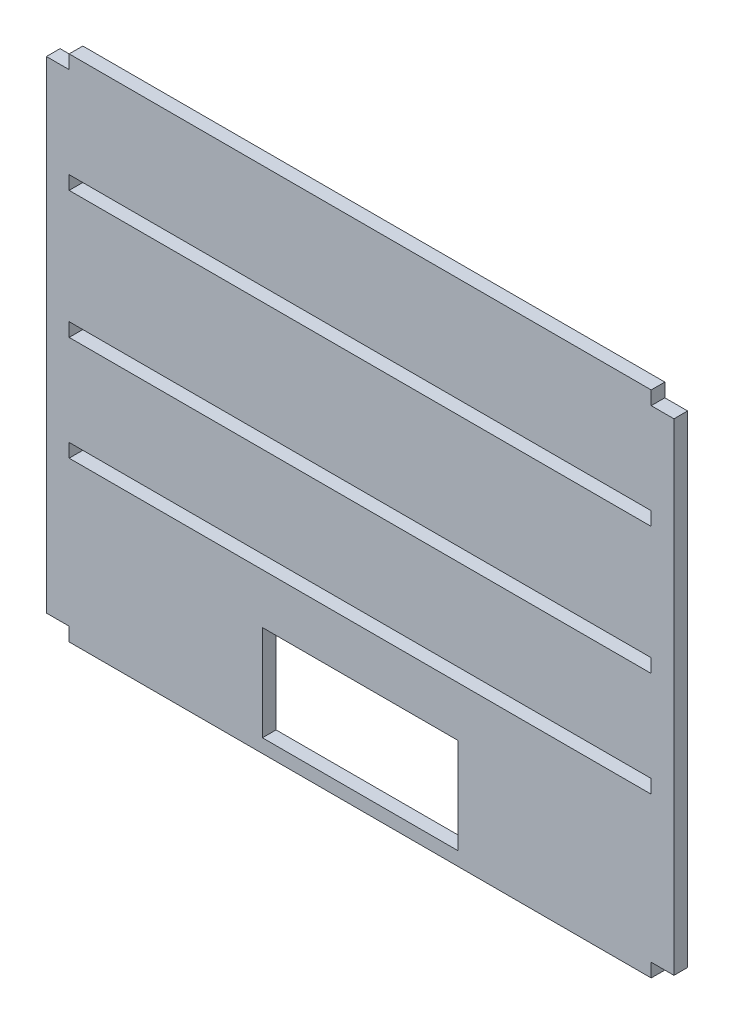
ISO-10303-21;
HEADER;
FILE_DESCRIPTION(('STEP AP214'),'2;1');
FILE_NAME('part.step','',(''),(''),'','','');
FILE_SCHEMA(('AUTOMOTIVE_DESIGN { 1 0 10303 214 1 1 1 1 }'));
ENDSEC;
DATA;
#1=APPLICATION_CONTEXT('core data for automotive mechanical design processes');
#2=APPLICATION_PROTOCOL_DEFINITION('international standard','automotive_design',2000,#1);
#3=PRODUCT_CONTEXT('',#1,'mechanical');
#4=PRODUCT('Part','Part','',(#3));
#5=PRODUCT_RELATED_PRODUCT_CATEGORY('part','',(#4));
#6=PRODUCT_DEFINITION_FORMATION('','',#4);
#7=PRODUCT_DEFINITION_CONTEXT('part definition',#1,'design');
#8=PRODUCT_DEFINITION('design','',#6,#7);
#9=PRODUCT_DEFINITION_SHAPE('','',#8);
#10=(LENGTH_UNIT() NAMED_UNIT(*) SI_UNIT(.MILLI.,.METRE.));
#11=(NAMED_UNIT(*) PLANE_ANGLE_UNIT() SI_UNIT($,.RADIAN.));
#12=(NAMED_UNIT(*) SI_UNIT($,.STERADIAN.) SOLID_ANGLE_UNIT());
#13=UNCERTAINTY_MEASURE_WITH_UNIT(LENGTH_MEASURE(1.E-05),#10,'distance_accuracy_value','');
#14=(GEOMETRIC_REPRESENTATION_CONTEXT(3) GLOBAL_UNCERTAINTY_ASSIGNED_CONTEXT((#13)) GLOBAL_UNIT_ASSIGNED_CONTEXT((#10,
#11,#12)) REPRESENTATION_CONTEXT('',''));
#15=CARTESIAN_POINT('',(0.,0.,0.));
#16=DIRECTION('',(0.,0.,1.));
#17=DIRECTION('',(1.,0.,0.));
#18=AXIS2_PLACEMENT_3D('',#15,#16,#17);
#19=CARTESIAN_POINT('',(0.,6.79387471644571,3.));
#20=DIRECTION('',(0.,1.,0.));
#21=DIRECTION('',(0.,0.,1.));
#22=AXIS2_PLACEMENT_3D('',#19,#20,#21);
#23=PLANE('',#22);
#24=DIRECTION('',(1.,0.,0.));
#25=VECTOR('',#24,1.);
#26=CARTESIAN_POINT('',(0.,6.79387471644571,0.));
#27=LINE('',#26,#25);
#28=CARTESIAN_POINT('',(-52.5,6.79387471644571,0.));
#29=VERTEX_POINT('',#28);
#30=CARTESIAN_POINT('',(-9.50000000000001,6.79387471644571,0.));
#31=VERTEX_POINT('',#30);
#32=EDGE_CURVE('E319',#29,#31,#27,.T.);
#33=ORIENTED_EDGE('',*,*,#32,.T.);
#34=DIRECTION('',(0.,0.,-1.));
#35=VECTOR('',#34,1.);
#36=CARTESIAN_POINT('',(-9.50000000000001,6.79387471644571,3.));
#37=LINE('',#36,#35);
#38=CARTESIAN_POINT('',(-9.50000000000001,6.79387471644571,3.));
#39=VERTEX_POINT('',#38);
#40=EDGE_CURVE('E11',#39,#31,#37,.T.);
#41=ORIENTED_EDGE('',*,*,#40,.F.);
#42=DIRECTION('',(1.,0.,0.));
#43=VECTOR('',#42,1.);
#44=CARTESIAN_POINT('',(0.,6.79387471644571,3.));
#45=LINE('',#44,#43);
#46=CARTESIAN_POINT('',(-52.5,6.79387471644571,3.));
#47=VERTEX_POINT('',#46);
#48=EDGE_CURVE('E232',#47,#39,#45,.T.);
#49=ORIENTED_EDGE('',*,*,#48,.F.);
#50=DIRECTION('',(0.,0.,-1.));
#51=VECTOR('',#50,1.);
#52=CARTESIAN_POINT('',(-52.5,6.79387471644571,3.));
#53=LINE('',#52,#51);
#54=EDGE_CURVE('E52',#47,#29,#53,.T.);
#55=ORIENTED_EDGE('',*,*,#54,.T.);
#56=EDGE_LOOP('',(#33,#41,#49,#55));
#57=FACE_BOUND('',#56,.T.);
#58=ADVANCED_FACE('F33',(#57),#23,.F.);
#59=CARTESIAN_POINT('',(-9.50000000000001,0.,3.));
#60=DIRECTION('',(1.,0.,0.));
#61=DIRECTION('',(0.,0.,-1.));
#62=AXIS2_PLACEMENT_3D('',#59,#60,#61);
#63=PLANE('',#62);
#64=DIRECTION('',(0.,-1.,0.));
#65=VECTOR('',#64,1.);
#66=CARTESIAN_POINT('',(-9.50000000000001,0.,0.));
#67=LINE('',#66,#65);
#68=CARTESIAN_POINT('',(-9.50000000000001,-14.2061252835543,0.));
#69=VERTEX_POINT('',#68);
#70=EDGE_CURVE('E238',#31,#69,#67,.T.);
#71=ORIENTED_EDGE('',*,*,#70,.T.);
#72=DIRECTION('',(0.,0.,-1.));
#73=VECTOR('',#72,1.);
#74=CARTESIAN_POINT('',(-9.50000000000001,-14.2061252835543,3.));
#75=LINE('',#74,#73);
#76=CARTESIAN_POINT('',(-9.50000000000001,-14.2061252835543,3.));
#77=VERTEX_POINT('',#76);
#78=EDGE_CURVE('E43',#77,#69,#75,.T.);
#79=ORIENTED_EDGE('',*,*,#78,.F.);
#80=DIRECTION('',(0.,-1.,0.));
#81=VECTOR('',#80,1.);
#82=CARTESIAN_POINT('',(-9.50000000000001,0.,3.));
#83=LINE('',#82,#81);
#84=EDGE_CURVE('E226',#39,#77,#83,.T.);
#85=ORIENTED_EDGE('',*,*,#84,.F.);
#86=ORIENTED_EDGE('',*,*,#40,.T.);
#87=EDGE_LOOP('',(#71,#79,#85,#86));
#88=FACE_BOUND('',#87,.T.);
#89=ADVANCED_FACE('F237',(#88),#63,.F.);
#90=CARTESIAN_POINT('',(0.,-14.2061252835543,3.));
#91=DIRECTION('',(0.,1.,0.));
#92=DIRECTION('',(0.,0.,1.));
#93=AXIS2_PLACEMENT_3D('',#90,#91,#92);
#94=PLANE('',#93);
#95=DIRECTION('',(1.,0.,0.));
#96=VECTOR('',#95,1.);
#97=CARTESIAN_POINT('',(0.,-14.2061252835543,0.));
#98=LINE('',#97,#96);
#99=CARTESIAN_POINT('',(-52.5,-14.2061252835543,0.));
#100=VERTEX_POINT('',#99);
#101=EDGE_CURVE('E322',#100,#69,#98,.T.);
#102=ORIENTED_EDGE('',*,*,#101,.F.);
#103=DIRECTION('',(0.,0.,-1.));
#104=VECTOR('',#103,1.);
#105=CARTESIAN_POINT('',(-52.5,-14.2061252835543,3.));
#106=LINE('',#105,#104);
#107=CARTESIAN_POINT('',(-52.5,-14.2061252835543,3.));
#108=VERTEX_POINT('',#107);
#109=EDGE_CURVE('E138',#108,#100,#106,.T.);
#110=ORIENTED_EDGE('',*,*,#109,.F.);
#111=DIRECTION('',(1.,0.,0.));
#112=VECTOR('',#111,1.);
#113=CARTESIAN_POINT('',(0.,-14.2061252835543,3.));
#114=LINE('',#113,#112);
#115=EDGE_CURVE('E231',#108,#77,#114,.T.);
#116=ORIENTED_EDGE('',*,*,#115,.T.);
#117=ORIENTED_EDGE('',*,*,#78,.T.);
#118=EDGE_LOOP('',(#102,#110,#116,#117));
#119=FACE_BOUND('',#118,.T.);
#120=ADVANCED_FACE('F242',(#119),#94,.T.);
#121=CARTESIAN_POINT('',(0.,20.7938747164452,3.));
#122=DIRECTION('',(0.,1.,0.));
#123=DIRECTION('',(-1.,0.,0.));
#124=AXIS2_PLACEMENT_3D('',#121,#122,#123);
#125=PLANE('',#124);
#126=DIRECTION('',(1.,0.,0.));
#127=VECTOR('',#126,1.);
#128=CARTESIAN_POINT('',(0.,20.7938747164452,0.));
#129=LINE('',#128,#127);
#130=CARTESIAN_POINT('',(-95.,20.7938747164451,0.));
#131=VERTEX_POINT('',#130);
#132=CARTESIAN_POINT('',(33.,20.7938747164452,0.));
#133=VERTEX_POINT('',#132);
#134=EDGE_CURVE('E307',#131,#133,#129,.T.);
#135=ORIENTED_EDGE('',*,*,#134,.T.);
#136=DIRECTION('',(0.,0.,-1.));
#137=VECTOR('',#136,1.);
#138=CARTESIAN_POINT('',(33.,20.7938747164452,3.));
#139=LINE('',#138,#137);
#140=CARTESIAN_POINT('',(33.,20.7938747164452,3.));
#141=VERTEX_POINT('',#140);
#142=EDGE_CURVE('E329',#141,#133,#139,.T.);
#143=ORIENTED_EDGE('',*,*,#142,.F.);
#144=DIRECTION('',(1.,0.,0.));
#145=VECTOR('',#144,1.);
#146=CARTESIAN_POINT('',(0.,20.7938747164452,3.));
#147=LINE('',#146,#145);
#148=CARTESIAN_POINT('',(-95.,20.7938747164451,3.));
#149=VERTEX_POINT('',#148);
#150=EDGE_CURVE('E449',#149,#141,#147,.T.);
#151=ORIENTED_EDGE('',*,*,#150,.F.);
#152=DIRECTION('',(0.,0.,-1.));
#153=VECTOR('',#152,1.);
#154=CARTESIAN_POINT('',(-95.,20.7938747164451,3.));
#155=LINE('',#154,#153);
#156=EDGE_CURVE('E331',#149,#131,#155,.T.);
#157=ORIENTED_EDGE('',*,*,#156,.T.);
#158=EDGE_LOOP('',(#135,#143,#151,#157));
#159=FACE_BOUND('',#158,.T.);
#160=ADVANCED_FACE('F475',(#159),#125,.F.);
#161=CARTESIAN_POINT('',(33.,0.,3.));
#162=DIRECTION('',(1.,0.,0.));
#163=DIRECTION('',(0.,0.,-1.));
#164=AXIS2_PLACEMENT_3D('',#161,#162,#163);
#165=PLANE('',#164);
#166=DIRECTION('',(0.,-1.,0.));
#167=VECTOR('',#166,1.);
#168=CARTESIAN_POINT('',(33.,0.,0.));
#169=LINE('',#168,#167);
#170=CARTESIAN_POINT('',(33.,17.7938747164457,0.));
#171=VERTEX_POINT('',#170);
#172=EDGE_CURVE('E310',#133,#171,#169,.T.);
#173=ORIENTED_EDGE('',*,*,#172,.T.);
#174=DIRECTION('',(0.,0.,-1.));
#175=VECTOR('',#174,1.);
#176=CARTESIAN_POINT('',(33.,17.7938747164457,3.));
#177=LINE('',#176,#175);
#178=CARTESIAN_POINT('',(33.,17.7938747164457,3.));
#179=VERTEX_POINT('',#178);
#180=EDGE_CURVE('E336',#179,#171,#177,.T.);
#181=ORIENTED_EDGE('',*,*,#180,.F.);
#182=DIRECTION('',(0.,-1.,0.));
#183=VECTOR('',#182,1.);
#184=CARTESIAN_POINT('',(33.,0.,3.));
#185=LINE('',#184,#183);
#186=EDGE_CURVE('E452',#141,#179,#185,.T.);
#187=ORIENTED_EDGE('',*,*,#186,.F.);
#188=ORIENTED_EDGE('',*,*,#142,.T.);
#189=EDGE_LOOP('',(#173,#181,#187,#188));
#190=FACE_BOUND('',#189,.T.);
#191=ADVANCED_FACE('F477',(#190),#165,.F.);
#192=CARTESIAN_POINT('',(0.,17.7938747164457,3.));
#193=DIRECTION('',(0.,1.,0.));
#194=DIRECTION('',(-1.,0.,0.));
#195=AXIS2_PLACEMENT_3D('',#192,#193,#194);
#196=PLANE('',#195);
#197=DIRECTION('',(1.,0.,0.));
#198=VECTOR('',#197,1.);
#199=CARTESIAN_POINT('',(0.,17.7938747164457,0.));
#200=LINE('',#199,#198);
#201=CARTESIAN_POINT('',(-95.,17.7938747164457,0.));
#202=VERTEX_POINT('',#201);
#203=EDGE_CURVE('E313',#202,#171,#200,.T.);
#204=ORIENTED_EDGE('',*,*,#203,.F.);
#205=DIRECTION('',(0.,0.,-1.));
#206=VECTOR('',#205,1.);
#207=CARTESIAN_POINT('',(-95.,17.7938747164457,3.));
#208=LINE('',#207,#206);
#209=CARTESIAN_POINT('',(-95.,17.7938747164457,3.));
#210=VERTEX_POINT('',#209);
#211=EDGE_CURVE('E333',#210,#202,#208,.T.);
#212=ORIENTED_EDGE('',*,*,#211,.F.);
#213=DIRECTION('',(1.,0.,0.));
#214=VECTOR('',#213,1.);
#215=CARTESIAN_POINT('',(0.,17.7938747164457,3.));
#216=LINE('',#215,#214);
#217=EDGE_CURVE('E454',#210,#179,#216,.T.);
#218=ORIENTED_EDGE('',*,*,#217,.T.);
#219=ORIENTED_EDGE('',*,*,#180,.T.);
#220=EDGE_LOOP('',(#204,#212,#218,#219));
#221=FACE_BOUND('',#220,.T.);
#222=ADVANCED_FACE('F470',(#221),#196,.T.);
#223=CARTESIAN_POINT('',(0.,43.7938747164451,3.));
#224=DIRECTION('',(0.,1.,0.));
#225=DIRECTION('',(-1.,0.,0.));
#226=AXIS2_PLACEMENT_3D('',#223,#224,#225);
#227=PLANE('',#226);
#228=DIRECTION('',(1.,0.,0.));
#229=VECTOR('',#228,1.);
#230=CARTESIAN_POINT('',(0.,43.7938747164451,0.));
#231=LINE('',#230,#229);
#232=CARTESIAN_POINT('',(-95.,43.7938747164451,0.));
#233=VERTEX_POINT('',#232);
#234=CARTESIAN_POINT('',(33.,43.7938747164451,0.));
#235=VERTEX_POINT('',#234);
#236=EDGE_CURVE('E295',#233,#235,#231,.T.);
#237=ORIENTED_EDGE('',*,*,#236,.T.);
#238=DIRECTION('',(0.,0.,-1.));
#239=VECTOR('',#238,1.);
#240=CARTESIAN_POINT('',(33.,43.7938747164451,3.));
#241=LINE('',#240,#239);
#242=CARTESIAN_POINT('',(33.,43.7938747164451,3.));
#243=VERTEX_POINT('',#242);
#244=EDGE_CURVE('E334',#243,#235,#241,.T.);
#245=ORIENTED_EDGE('',*,*,#244,.F.);
#246=DIRECTION('',(1.,0.,0.));
#247=VECTOR('',#246,1.);
#248=CARTESIAN_POINT('',(0.,43.7938747164451,3.));
#249=LINE('',#248,#247);
#250=CARTESIAN_POINT('',(-95.,43.7938747164451,3.));
#251=VERTEX_POINT('',#250);
#252=EDGE_CURVE('E438',#251,#243,#249,.T.);
#253=ORIENTED_EDGE('',*,*,#252,.F.);
#254=DIRECTION('',(0.,0.,-1.));
#255=VECTOR('',#254,1.);
#256=CARTESIAN_POINT('',(-95.,43.7938747164451,3.));
#257=LINE('',#256,#255);
#258=EDGE_CURVE('E340',#251,#233,#257,.T.);
#259=ORIENTED_EDGE('',*,*,#258,.T.);
#260=EDGE_LOOP('',(#237,#245,#253,#259));
#261=FACE_BOUND('',#260,.T.);
#262=ADVANCED_FACE('F484',(#261),#227,.F.);
#263=CARTESIAN_POINT('',(33.0000000000002,1.5265566588596E-13,3.));
#264=DIRECTION('',(1.,0.,0.));
#265=DIRECTION('',(0.,1.,0.));
#266=AXIS2_PLACEMENT_3D('',#263,#264,#265);
#267=PLANE('',#266);
#268=DIRECTION('',(0.,-1.,0.));
#269=VECTOR('',#268,1.);
#270=CARTESIAN_POINT('',(33.0000000000002,1.5265566588596E-13,0.));
#271=LINE('',#270,#269);
#272=CARTESIAN_POINT('',(33.,40.7938747164451,0.));
#273=VERTEX_POINT('',#272);
#274=EDGE_CURVE('E298',#235,#273,#271,.T.);
#275=ORIENTED_EDGE('',*,*,#274,.T.);
#276=DIRECTION('',(0.,0.,-1.));
#277=VECTOR('',#276,1.);
#278=CARTESIAN_POINT('',(33.,40.7938747164451,3.));
#279=LINE('',#278,#277);
#280=CARTESIAN_POINT('',(33.,40.7938747164451,3.));
#281=VERTEX_POINT('',#280);
#282=EDGE_CURVE('E345',#281,#273,#279,.T.);
#283=ORIENTED_EDGE('',*,*,#282,.F.);
#284=DIRECTION('',(0.,-1.,0.));
#285=VECTOR('',#284,1.);
#286=CARTESIAN_POINT('',(33.0000000000002,1.5265566588596E-13,3.));
#287=LINE('',#286,#285);
#288=EDGE_CURVE('E441',#243,#281,#287,.T.);
#289=ORIENTED_EDGE('',*,*,#288,.F.);
#290=ORIENTED_EDGE('',*,*,#244,.T.);
#291=EDGE_LOOP('',(#275,#283,#289,#290));
#292=FACE_BOUND('',#291,.T.);
#293=ADVANCED_FACE('F567',(#292),#267,.F.);
#294=CARTESIAN_POINT('',(0.,40.7938747164451,3.));
#295=DIRECTION('',(0.,1.,0.));
#296=DIRECTION('',(-1.,0.,0.));
#297=AXIS2_PLACEMENT_3D('',#294,#295,#296);
#298=PLANE('',#297);
#299=DIRECTION('',(1.,0.,0.));
#300=VECTOR('',#299,1.);
#301=CARTESIAN_POINT('',(0.,40.7938747164451,0.));
#302=LINE('',#301,#300);
#303=CARTESIAN_POINT('',(-95.,40.7938747164451,0.));
#304=VERTEX_POINT('',#303);
#305=EDGE_CURVE('E301',#304,#273,#302,.T.);
#306=ORIENTED_EDGE('',*,*,#305,.F.);
#307=DIRECTION('',(0.,0.,-1.));
#308=VECTOR('',#307,1.);
#309=CARTESIAN_POINT('',(-95.,40.7938747164451,3.));
#310=LINE('',#309,#308);
#311=CARTESIAN_POINT('',(-95.,40.7938747164451,3.));
#312=VERTEX_POINT('',#311);
#313=EDGE_CURVE('E342',#312,#304,#310,.T.);
#314=ORIENTED_EDGE('',*,*,#313,.F.);
#315=DIRECTION('',(1.,0.,0.));
#316=VECTOR('',#315,1.);
#317=CARTESIAN_POINT('',(0.,40.7938747164451,3.));
#318=LINE('',#317,#316);
#319=EDGE_CURVE('E443',#312,#281,#318,.T.);
#320=ORIENTED_EDGE('',*,*,#319,.T.);
#321=ORIENTED_EDGE('',*,*,#282,.T.);
#322=EDGE_LOOP('',(#306,#314,#320,#321));
#323=FACE_BOUND('',#322,.T.);
#324=ADVANCED_FACE('F562',(#323),#298,.T.);
#325=CARTESIAN_POINT('',(0.,71.7938747164451,3.));
#326=DIRECTION('',(0.,1.,0.));
#327=DIRECTION('',(0.,0.,1.));
#328=AXIS2_PLACEMENT_3D('',#325,#326,#327);
#329=PLANE('',#328);
#330=DIRECTION('',(1.,0.,0.));
#331=VECTOR('',#330,1.);
#332=CARTESIAN_POINT('',(0.,71.7938747164451,0.));
#333=LINE('',#332,#331);
#334=CARTESIAN_POINT('',(-95.,71.7938747164451,0.));
#335=VERTEX_POINT('',#334);
#336=CARTESIAN_POINT('',(33.,71.7938747164451,0.));
#337=VERTEX_POINT('',#336);
#338=EDGE_CURVE('E283',#335,#337,#333,.T.);
#339=ORIENTED_EDGE('',*,*,#338,.T.);
#340=DIRECTION('',(0.,0.,-1.));
#341=VECTOR('',#340,1.);
#342=CARTESIAN_POINT('',(33.,71.7938747164451,3.));
#343=LINE('',#342,#341);
#344=CARTESIAN_POINT('',(33.,71.7938747164451,3.));
#345=VERTEX_POINT('',#344);
#346=EDGE_CURVE('E343',#345,#337,#343,.T.);
#347=ORIENTED_EDGE('',*,*,#346,.F.);
#348=DIRECTION('',(1.,0.,0.));
#349=VECTOR('',#348,1.);
#350=CARTESIAN_POINT('',(0.,71.7938747164451,3.));
#351=LINE('',#350,#349);
#352=CARTESIAN_POINT('',(-95.,71.7938747164451,3.));
#353=VERTEX_POINT('',#352);
#354=EDGE_CURVE('E427',#353,#345,#351,.T.);
#355=ORIENTED_EDGE('',*,*,#354,.F.);
#356=DIRECTION('',(0.,0.,-1.));
#357=VECTOR('',#356,1.);
#358=CARTESIAN_POINT('',(-95.,71.7938747164451,3.));
#359=LINE('',#358,#357);
#360=EDGE_CURVE('E349',#353,#335,#359,.T.);
#361=ORIENTED_EDGE('',*,*,#360,.T.);
#362=EDGE_LOOP('',(#339,#347,#355,#361));
#363=FACE_BOUND('',#362,.T.);
#364=ADVANCED_FACE('F555',(#363),#329,.F.);
#365=CARTESIAN_POINT('',(32.9999999999998,0.,3.));
#366=DIRECTION('',(1.,0.,0.));
#367=DIRECTION('',(0.,1.,0.));
#368=AXIS2_PLACEMENT_3D('',#365,#366,#367);
#369=PLANE('',#368);
#370=DIRECTION('',(0.,-1.,0.));
#371=VECTOR('',#370,1.);
#372=CARTESIAN_POINT('',(32.9999999999998,0.,0.));
#373=LINE('',#372,#371);
#374=CARTESIAN_POINT('',(33.,68.7938747164452,0.));
#375=VERTEX_POINT('',#374);
#376=EDGE_CURVE('E286',#337,#375,#373,.T.);
#377=ORIENTED_EDGE('',*,*,#376,.T.);
#378=DIRECTION('',(0.,0.,-1.));
#379=VECTOR('',#378,1.);
#380=CARTESIAN_POINT('',(33.,68.7938747164452,3.));
#381=LINE('',#380,#379);
#382=CARTESIAN_POINT('',(33.,68.7938747164452,3.));
#383=VERTEX_POINT('',#382);
#384=EDGE_CURVE('E353',#383,#375,#381,.T.);
#385=ORIENTED_EDGE('',*,*,#384,.F.);
#386=DIRECTION('',(0.,-1.,0.));
#387=VECTOR('',#386,1.);
#388=CARTESIAN_POINT('',(32.9999999999998,0.,3.));
#389=LINE('',#388,#387);
#390=EDGE_CURVE('E430',#345,#383,#389,.T.);
#391=ORIENTED_EDGE('',*,*,#390,.F.);
#392=ORIENTED_EDGE('',*,*,#346,.T.);
#393=EDGE_LOOP('',(#377,#385,#391,#392));
#394=FACE_BOUND('',#393,.T.);
#395=ADVANCED_FACE('F549',(#394),#369,.F.);
#396=CARTESIAN_POINT('',(0.,68.7938747164452,3.));
#397=DIRECTION('',(0.,1.,0.));
#398=DIRECTION('',(-1.,0.,0.));
#399=AXIS2_PLACEMENT_3D('',#396,#397,#398);
#400=PLANE('',#399);
#401=DIRECTION('',(1.,0.,0.));
#402=VECTOR('',#401,1.);
#403=CARTESIAN_POINT('',(0.,68.7938747164452,0.));
#404=LINE('',#403,#402);
#405=CARTESIAN_POINT('',(-95.,68.7938747164451,0.));
#406=VERTEX_POINT('',#405);
#407=EDGE_CURVE('E289',#406,#375,#404,.T.);
#408=ORIENTED_EDGE('',*,*,#407,.F.);
#409=DIRECTION('',(0.,0.,-1.));
#410=VECTOR('',#409,1.);
#411=CARTESIAN_POINT('',(-95.,68.7938747164451,3.));
#412=LINE('',#411,#410);
#413=CARTESIAN_POINT('',(-95.,68.7938747164451,3.));
#414=VERTEX_POINT('',#413);
#415=EDGE_CURVE('E351',#414,#406,#412,.T.);
#416=ORIENTED_EDGE('',*,*,#415,.F.);
#417=DIRECTION('',(1.,0.,0.));
#418=VECTOR('',#417,1.);
#419=CARTESIAN_POINT('',(0.,68.7938747164452,3.));
#420=LINE('',#419,#418);
#421=EDGE_CURVE('E432',#414,#383,#420,.T.);
#422=ORIENTED_EDGE('',*,*,#421,.T.);
#423=ORIENTED_EDGE('',*,*,#384,.T.);
#424=EDGE_LOOP('',(#408,#416,#422,#423));
#425=FACE_BOUND('',#424,.T.);
#426=ADVANCED_FACE('F545',(#425),#400,.T.);
#427=CARTESIAN_POINT('',(-94.9999999999999,4.39463280580787E-13,3.));
#428=DIRECTION('',(-1.,0.,0.));
#429=DIRECTION('',(0.,-1.,0.));
#430=AXIS2_PLACEMENT_3D('',#427,#428,#429);
#431=PLANE('',#430);
#432=DIRECTION('',(0.,1.,0.));
#433=VECTOR('',#432,1.);
#434=CARTESIAN_POINT('',(-94.9999999999999,4.39463280580787E-13,0.));
#435=LINE('',#434,#433);
#436=CARTESIAN_POINT('',(-95.,-17.2061252835543,0.));
#437=VERTEX_POINT('',#436);
#438=CARTESIAN_POINT('',(-95.,-14.2061252835543,0.));
#439=VERTEX_POINT('',#438);
#440=EDGE_CURVE('E249',#437,#439,#435,.T.);
#441=ORIENTED_EDGE('',*,*,#440,.F.);
#442=DIRECTION('',(0.,0.,-1.));
#443=VECTOR('',#442,1.);
#444=CARTESIAN_POINT('',(-95.,-17.2061252835543,3.));
#445=LINE('',#444,#443);
#446=CARTESIAN_POINT('',(-95.,-17.2061252835543,3.));
#447=VERTEX_POINT('',#446);
#448=EDGE_CURVE('E37',#447,#437,#445,.T.);
#449=ORIENTED_EDGE('',*,*,#448,.F.);
#450=DIRECTION('',(0.,1.,0.));
#451=VECTOR('',#450,1.);
#452=CARTESIAN_POINT('',(-94.9999999999999,4.39463280580787E-13,3.));
#453=LINE('',#452,#451);
#454=CARTESIAN_POINT('',(-95.,-14.2061252835543,3.));
#455=VERTEX_POINT('',#454);
#456=EDGE_CURVE('E327',#447,#455,#453,.T.);
#457=ORIENTED_EDGE('',*,*,#456,.T.);
#458=DIRECTION('',(0.,0.,-1.));
#459=VECTOR('',#458,1.);
#460=CARTESIAN_POINT('',(-95.,-14.2061252835543,3.));
#461=LINE('',#460,#459);
#462=EDGE_CURVE('E245',#455,#439,#461,.T.);
#463=ORIENTED_EDGE('',*,*,#462,.T.);
#464=EDGE_LOOP('',(#441,#449,#457,#463));
#465=FACE_BOUND('',#464,.T.);
#466=ADVANCED_FACE('F35',(#465),#431,.T.);
#467=CARTESIAN_POINT('',(0.,-17.2061252835543,3.));
#468=DIRECTION('',(0.,-1.,0.));
#469=DIRECTION('',(0.,0.,-1.));
#470=AXIS2_PLACEMENT_3D('',#467,#468,#469);
#471=PLANE('',#470);
#472=DIRECTION('',(-1.,0.,0.));
#473=VECTOR('',#472,1.);
#474=CARTESIAN_POINT('',(0.,-17.2061252835543,0.));
#475=LINE('',#474,#473);
#476=CARTESIAN_POINT('',(33.,-17.2061252835543,0.));
#477=VERTEX_POINT('',#476);
#478=EDGE_CURVE('E252',#477,#437,#475,.T.);
#479=ORIENTED_EDGE('',*,*,#478,.F.);
#480=DIRECTION('',(0.,0.,-1.));
#481=VECTOR('',#480,1.);
#482=CARTESIAN_POINT('',(33.,-17.2061252835543,3.));
#483=LINE('',#482,#481);
#484=CARTESIAN_POINT('',(33.,-17.2061252835543,3.));
#485=VERTEX_POINT('',#484);
#486=EDGE_CURVE('E377',#485,#477,#483,.T.);
#487=ORIENTED_EDGE('',*,*,#486,.F.);
#488=DIRECTION('',(-1.,0.,0.));
#489=VECTOR('',#488,1.);
#490=CARTESIAN_POINT('',(0.,-17.2061252835543,3.));
#491=LINE('',#490,#489);
#492=EDGE_CURVE('E386',#485,#447,#491,.T.);
#493=ORIENTED_EDGE('',*,*,#492,.T.);
#494=ORIENTED_EDGE('',*,*,#448,.T.);
#495=EDGE_LOOP('',(#479,#487,#493,#494));
#496=FACE_BOUND('',#495,.T.);
#497=ADVANCED_FACE('F384',(#496),#471,.T.);
#498=CARTESIAN_POINT('',(33.,0.,3.));
#499=DIRECTION('',(-1.,0.,0.));
#500=DIRECTION('',(0.,0.,1.));
#501=AXIS2_PLACEMENT_3D('',#498,#499,#500);
#502=PLANE('',#501);
#503=DIRECTION('',(0.,1.,0.));
#504=VECTOR('',#503,1.);
#505=CARTESIAN_POINT('',(33.,0.,0.));
#506=LINE('',#505,#504);
#507=CARTESIAN_POINT('',(33.,-14.2061252835543,0.));
#508=VERTEX_POINT('',#507);
#509=EDGE_CURVE('E255',#477,#508,#506,.T.);
#510=ORIENTED_EDGE('',*,*,#509,.T.);
#511=DIRECTION('',(0.,0.,-1.));
#512=VECTOR('',#511,1.);
#513=CARTESIAN_POINT('',(33.,-14.2061252835543,3.));
#514=LINE('',#513,#512);
#515=CARTESIAN_POINT('',(33.,-14.2061252835543,3.));
#516=VERTEX_POINT('',#515);
#517=EDGE_CURVE('E376',#516,#508,#514,.T.);
#518=ORIENTED_EDGE('',*,*,#517,.F.);
#519=DIRECTION('',(0.,1.,0.));
#520=VECTOR('',#519,1.);
#521=CARTESIAN_POINT('',(33.,0.,3.));
#522=LINE('',#521,#520);
#523=EDGE_CURVE('E397',#485,#516,#522,.T.);
#524=ORIENTED_EDGE('',*,*,#523,.F.);
#525=ORIENTED_EDGE('',*,*,#486,.T.);
#526=EDGE_LOOP('',(#510,#518,#524,#525));
#527=FACE_BOUND('',#526,.T.);
#528=ADVANCED_FACE('F395',(#527),#502,.F.);
#529=CARTESIAN_POINT('',(0.,-14.2061252835544,3.));
#530=DIRECTION('',(0.,-1.,0.));
#531=DIRECTION('',(1.,0.,0.));
#532=AXIS2_PLACEMENT_3D('',#529,#530,#531);
#533=PLANE('',#532);
#534=DIRECTION('',(-1.,0.,0.));
#535=VECTOR('',#534,1.);
#536=CARTESIAN_POINT('',(0.,-14.2061252835544,0.));
#537=LINE('',#536,#535);
#538=CARTESIAN_POINT('',(38.,-14.2061252835543,0.));
#539=VERTEX_POINT('',#538);
#540=EDGE_CURVE('E258',#539,#508,#537,.T.);
#541=ORIENTED_EDGE('',*,*,#540,.F.);
#542=DIRECTION('',(0.,0.,-1.));
#543=VECTOR('',#542,1.);
#544=CARTESIAN_POINT('',(38.,-14.2061252835543,3.));
#545=LINE('',#544,#543);
#546=CARTESIAN_POINT('',(38.,-14.2061252835543,3.));
#547=VERTEX_POINT('',#546);
#548=EDGE_CURVE('E374',#547,#539,#545,.T.);
#549=ORIENTED_EDGE('',*,*,#548,.F.);
#550=DIRECTION('',(-1.,0.,0.));
#551=VECTOR('',#550,1.);
#552=CARTESIAN_POINT('',(0.,-14.2061252835544,3.));
#553=LINE('',#552,#551);
#554=EDGE_CURVE('E400',#547,#516,#553,.T.);
#555=ORIENTED_EDGE('',*,*,#554,.T.);
#556=ORIENTED_EDGE('',*,*,#517,.T.);
#557=EDGE_LOOP('',(#541,#549,#555,#556));
#558=FACE_BOUND('',#557,.T.);
#559=ADVANCED_FACE('F401',(#558),#533,.T.);
#560=CARTESIAN_POINT('',(38.,0.,3.));
#561=DIRECTION('',(-1.,0.,0.));
#562=DIRECTION('',(0.,-1.,0.));
#563=AXIS2_PLACEMENT_3D('',#560,#561,#562);
#564=PLANE('',#563);
#565=DIRECTION('',(0.,1.,0.));
#566=VECTOR('',#565,1.);
#567=CARTESIAN_POINT('',(38.,0.,0.));
#568=LINE('',#567,#566);
#569=CARTESIAN_POINT('',(38.,91.7938747164457,0.));
#570=VERTEX_POINT('',#569);
#571=EDGE_CURVE('E261',#539,#570,#568,.T.);
#572=ORIENTED_EDGE('',*,*,#571,.T.);
#573=DIRECTION('',(0.,0.,-1.));
#574=VECTOR('',#573,1.);
#575=CARTESIAN_POINT('',(38.,91.7938747164457,3.));
#576=LINE('',#575,#574);
#577=CARTESIAN_POINT('',(38.,91.7938747164457,3.));
#578=VERTEX_POINT('',#577);
#579=EDGE_CURVE('E371',#578,#570,#576,.T.);
#580=ORIENTED_EDGE('',*,*,#579,.F.);
#581=DIRECTION('',(0.,1.,0.));
#582=VECTOR('',#581,1.);
#583=CARTESIAN_POINT('',(38.,0.,3.));
#584=LINE('',#583,#582);
#585=EDGE_CURVE('E404',#547,#578,#584,.T.);
#586=ORIENTED_EDGE('',*,*,#585,.F.);
#587=ORIENTED_EDGE('',*,*,#548,.T.);
#588=EDGE_LOOP('',(#572,#580,#586,#587));
#589=FACE_BOUND('',#588,.T.);
#590=ADVANCED_FACE('F533',(#589),#564,.F.);
#591=CARTESIAN_POINT('',(-2.54779183074387E-13,91.7938747164456,3.));
#592=DIRECTION('',(0.,-1.,0.));
#593=DIRECTION('',(1.,0.,0.));
#594=AXIS2_PLACEMENT_3D('',#591,#592,#593);
#595=PLANE('',#594);
#596=DIRECTION('',(-1.,0.,0.));
#597=VECTOR('',#596,1.);
#598=CARTESIAN_POINT('',(-2.54779183074387E-13,91.7938747164456,0.));
#599=LINE('',#598,#597);
#600=CARTESIAN_POINT('',(33.,91.7938747164457,0.));
#601=VERTEX_POINT('',#600);
#602=EDGE_CURVE('E263',#570,#601,#599,.T.);
#603=ORIENTED_EDGE('',*,*,#602,.T.);
#604=DIRECTION('',(0.,0.,-1.));
#605=VECTOR('',#604,1.);
#606=CARTESIAN_POINT('',(33.,91.7938747164457,3.));
#607=LINE('',#606,#605);
#608=CARTESIAN_POINT('',(33.,91.7938747164457,3.));
#609=VERTEX_POINT('',#608);
#610=EDGE_CURVE('E369',#609,#601,#607,.T.);
#611=ORIENTED_EDGE('',*,*,#610,.F.);
#612=DIRECTION('',(-1.,0.,0.));
#613=VECTOR('',#612,1.);
#614=CARTESIAN_POINT('',(-2.54779183074387E-13,91.7938747164456,3.));
#615=LINE('',#614,#613);
#616=EDGE_CURVE('E406',#578,#609,#615,.T.);
#617=ORIENTED_EDGE('',*,*,#616,.F.);
#618=ORIENTED_EDGE('',*,*,#579,.T.);
#619=EDGE_LOOP('',(#603,#611,#617,#618));
#620=FACE_BOUND('',#619,.T.);
#621=ADVANCED_FACE('F529',(#620),#595,.F.);
#622=CARTESIAN_POINT('',(33.,0.,3.));
#623=DIRECTION('',(1.,0.,0.));
#624=DIRECTION('',(0.,0.,-1.));
#625=AXIS2_PLACEMENT_3D('',#622,#623,#624);
#626=PLANE('',#625);
#627=DIRECTION('',(0.,-1.,0.));
#628=VECTOR('',#627,1.);
#629=CARTESIAN_POINT('',(33.,0.,0.));
#630=LINE('',#629,#628);
#631=CARTESIAN_POINT('',(33.,94.7938747164457,0.));
#632=VERTEX_POINT('',#631);
#633=EDGE_CURVE('E266',#632,#601,#630,.T.);
#634=ORIENTED_EDGE('',*,*,#633,.F.);
#635=DIRECTION('',(0.,0.,-1.));
#636=VECTOR('',#635,1.);
#637=CARTESIAN_POINT('',(33.,94.7938747164457,3.));
#638=LINE('',#637,#636);
#639=CARTESIAN_POINT('',(33.,94.7938747164457,3.));
#640=VERTEX_POINT('',#639);
#641=EDGE_CURVE('E367',#640,#632,#638,.T.);
#642=ORIENTED_EDGE('',*,*,#641,.F.);
#643=DIRECTION('',(0.,-1.,0.));
#644=VECTOR('',#643,1.);
#645=CARTESIAN_POINT('',(33.,0.,3.));
#646=LINE('',#645,#644);
#647=EDGE_CURVE('E412',#640,#609,#646,.T.);
#648=ORIENTED_EDGE('',*,*,#647,.T.);
#649=ORIENTED_EDGE('',*,*,#610,.T.);
#650=EDGE_LOOP('',(#634,#642,#648,#649));
#651=FACE_BOUND('',#650,.T.);
#652=ADVANCED_FACE('F525',(#651),#626,.T.);
#653=CARTESIAN_POINT('',(0.,94.7938747164457,3.));
#654=DIRECTION('',(0.,-1.,0.));
#655=DIRECTION('',(1.,0.,0.));
#656=AXIS2_PLACEMENT_3D('',#653,#654,#655);
#657=PLANE('',#656);
#658=DIRECTION('',(-1.,0.,0.));
#659=VECTOR('',#658,1.);
#660=CARTESIAN_POINT('',(0.,94.7938747164457,0.));
#661=LINE('',#660,#659);
#662=CARTESIAN_POINT('',(-95.,94.7938747164457,0.));
#663=VERTEX_POINT('',#662);
#664=EDGE_CURVE('E269',#632,#663,#661,.T.);
#665=ORIENTED_EDGE('',*,*,#664,.T.);
#666=DIRECTION('',(0.,0.,-1.));
#667=VECTOR('',#666,1.);
#668=CARTESIAN_POINT('',(-95.,94.7938747164457,3.));
#669=LINE('',#668,#667);
#670=CARTESIAN_POINT('',(-95.,94.7938747164457,3.));
#671=VERTEX_POINT('',#670);
#672=EDGE_CURVE('E364',#671,#663,#669,.T.);
#673=ORIENTED_EDGE('',*,*,#672,.F.);
#674=DIRECTION('',(-1.,0.,0.));
#675=VECTOR('',#674,1.);
#676=CARTESIAN_POINT('',(0.,94.7938747164457,3.));
#677=LINE('',#676,#675);
#678=EDGE_CURVE('E415',#640,#671,#677,.T.);
#679=ORIENTED_EDGE('',*,*,#678,.F.);
#680=ORIENTED_EDGE('',*,*,#641,.T.);
#681=EDGE_LOOP('',(#665,#673,#679,#680));
#682=FACE_BOUND('',#681,.T.);
#683=ADVANCED_FACE('F521',(#682),#657,.F.);
#684=CARTESIAN_POINT('',(-95.,0.,3.));
#685=DIRECTION('',(1.,0.,0.));
#686=DIRECTION('',(0.,0.,-1.));
#687=AXIS2_PLACEMENT_3D('',#684,#685,#686);
#688=PLANE('',#687);
#689=DIRECTION('',(0.,-1.,0.));
#690=VECTOR('',#689,1.);
#691=CARTESIAN_POINT('',(-95.,0.,0.));
#692=LINE('',#691,#690);
#693=CARTESIAN_POINT('',(-95.,91.7938747164451,0.));
#694=VERTEX_POINT('',#693);
#695=EDGE_CURVE('E271',#663,#694,#692,.T.);
#696=ORIENTED_EDGE('',*,*,#695,.T.);
#697=DIRECTION('',(0.,0.,-1.));
#698=VECTOR('',#697,1.);
#699=CARTESIAN_POINT('',(-95.,91.7938747164451,3.));
#700=LINE('',#699,#698);
#701=CARTESIAN_POINT('',(-95.,91.7938747164451,3.));
#702=VERTEX_POINT('',#701);
#703=EDGE_CURVE('E362',#702,#694,#700,.T.);
#704=ORIENTED_EDGE('',*,*,#703,.F.);
#705=DIRECTION('',(0.,-1.,0.));
#706=VECTOR('',#705,1.);
#707=CARTESIAN_POINT('',(-95.,0.,3.));
#708=LINE('',#707,#706);
#709=EDGE_CURVE('E417',#671,#702,#708,.T.);
#710=ORIENTED_EDGE('',*,*,#709,.F.);
#711=ORIENTED_EDGE('',*,*,#672,.T.);
#712=EDGE_LOOP('',(#696,#704,#710,#711));
#713=FACE_BOUND('',#712,.T.);
#714=ADVANCED_FACE('F511',(#713),#688,.F.);
#715=CARTESIAN_POINT('',(2.54779183074385E-13,91.7938747164449,3.));
#716=DIRECTION('',(0.,1.,0.));
#717=DIRECTION('',(-1.,0.,0.));
#718=AXIS2_PLACEMENT_3D('',#715,#716,#717);
#719=PLANE('',#718);
#720=DIRECTION('',(1.,0.,0.));
#721=VECTOR('',#720,1.);
#722=CARTESIAN_POINT('',(2.54779183074385E-13,91.7938747164449,0.));
#723=LINE('',#722,#721);
#724=CARTESIAN_POINT('',(-100.,91.7938747164451,0.));
#725=VERTEX_POINT('',#724);
#726=EDGE_CURVE('E274',#725,#694,#723,.T.);
#727=ORIENTED_EDGE('',*,*,#726,.F.);
#728=DIRECTION('',(0.,0.,-1.));
#729=VECTOR('',#728,1.);
#730=CARTESIAN_POINT('',(-100.,91.7938747164451,3.));
#731=LINE('',#730,#729);
#732=CARTESIAN_POINT('',(-100.,91.7938747164451,3.));
#733=VERTEX_POINT('',#732);
#734=EDGE_CURVE('E360',#733,#725,#731,.T.);
#735=ORIENTED_EDGE('',*,*,#734,.F.);
#736=DIRECTION('',(1.,0.,0.));
#737=VECTOR('',#736,1.);
#738=CARTESIAN_POINT('',(2.54779183074385E-13,91.7938747164449,3.));
#739=LINE('',#738,#737);
#740=EDGE_CURVE('E419',#733,#702,#739,.T.);
#741=ORIENTED_EDGE('',*,*,#740,.T.);
#742=ORIENTED_EDGE('',*,*,#703,.T.);
#743=EDGE_LOOP('',(#727,#735,#741,#742));
#744=FACE_BOUND('',#743,.T.);
#745=ADVANCED_FACE('F505',(#744),#719,.T.);
#746=CARTESIAN_POINT('',(-100.,0.,3.));
#747=DIRECTION('',(-1.,0.,0.));
#748=DIRECTION('',(0.,0.,1.));
#749=AXIS2_PLACEMENT_3D('',#746,#747,#748);
#750=PLANE('',#749);
#751=DIRECTION('',(0.,1.,0.));
#752=VECTOR('',#751,1.);
#753=CARTESIAN_POINT('',(-100.,0.,0.));
#754=LINE('',#753,#752);
#755=CARTESIAN_POINT('',(-100.,-14.2061252835543,0.));
#756=VERTEX_POINT('',#755);
#757=EDGE_CURVE('E277',#756,#725,#754,.T.);
#758=ORIENTED_EDGE('',*,*,#757,.F.);
#759=DIRECTION('',(0.,0.,-1.));
#760=VECTOR('',#759,1.);
#761=CARTESIAN_POINT('',(-100.,-14.2061252835543,3.));
#762=LINE('',#761,#760);
#763=CARTESIAN_POINT('',(-100.,-14.2061252835543,3.));
#764=VERTEX_POINT('',#763);
#765=EDGE_CURVE('E358',#764,#756,#762,.T.);
#766=ORIENTED_EDGE('',*,*,#765,.F.);
#767=DIRECTION('',(0.,1.,0.));
#768=VECTOR('',#767,1.);
#769=CARTESIAN_POINT('',(-100.,0.,3.));
#770=LINE('',#769,#768);
#771=EDGE_CURVE('E422',#764,#733,#770,.T.);
#772=ORIENTED_EDGE('',*,*,#771,.T.);
#773=ORIENTED_EDGE('',*,*,#734,.T.);
#774=EDGE_LOOP('',(#758,#766,#772,#773));
#775=FACE_BOUND('',#774,.T.);
#776=ADVANCED_FACE('F497',(#775),#750,.T.);
#777=CARTESIAN_POINT('',(-95.,0.,3.));
#778=DIRECTION('',(1.,0.,0.));
#779=DIRECTION('',(0.,0.,-1.));
#780=AXIS2_PLACEMENT_3D('',#777,#778,#779);
#781=PLANE('',#780);
#782=DIRECTION('',(0.,-1.,0.));
#783=VECTOR('',#782,1.);
#784=CARTESIAN_POINT('',(-95.,0.,0.));
#785=LINE('',#784,#783);
#786=EDGE_CURVE('E316',#131,#202,#785,.T.);
#787=ORIENTED_EDGE('',*,*,#786,.F.);
#788=ORIENTED_EDGE('',*,*,#156,.F.);
#789=DIRECTION('',(0.,-1.,0.));
#790=VECTOR('',#789,1.);
#791=CARTESIAN_POINT('',(-95.,0.,3.));
#792=LINE('',#791,#790);
#793=EDGE_CURVE('E457',#149,#210,#792,.T.);
#794=ORIENTED_EDGE('',*,*,#793,.T.);
#795=ORIENTED_EDGE('',*,*,#211,.T.);
#796=EDGE_LOOP('',(#787,#788,#794,#795));
#797=FACE_BOUND('',#796,.T.);
#798=ADVANCED_FACE('F462',(#797),#781,.T.);
#799=CARTESIAN_POINT('',(-95.,0.,3.));
#800=DIRECTION('',(1.,0.,0.));
#801=DIRECTION('',(0.,0.,-1.));
#802=AXIS2_PLACEMENT_3D('',#799,#800,#801);
#803=PLANE('',#802);
#804=DIRECTION('',(0.,-1.,0.));
#805=VECTOR('',#804,1.);
#806=CARTESIAN_POINT('',(-95.,0.,0.));
#807=LINE('',#806,#805);
#808=EDGE_CURVE('E304',#233,#304,#807,.T.);
#809=ORIENTED_EDGE('',*,*,#808,.F.);
#810=ORIENTED_EDGE('',*,*,#258,.F.);
#811=DIRECTION('',(0.,-1.,0.));
#812=VECTOR('',#811,1.);
#813=CARTESIAN_POINT('',(-95.,0.,3.));
#814=LINE('',#813,#812);
#815=EDGE_CURVE('E446',#251,#312,#814,.T.);
#816=ORIENTED_EDGE('',*,*,#815,.T.);
#817=ORIENTED_EDGE('',*,*,#313,.T.);
#818=EDGE_LOOP('',(#809,#810,#816,#817));
#819=FACE_BOUND('',#818,.T.);
#820=ADVANCED_FACE('F496',(#819),#803,.T.);
#821=CARTESIAN_POINT('',(-95.,0.,3.));
#822=DIRECTION('',(1.,0.,0.));
#823=DIRECTION('',(0.,0.,-1.));
#824=AXIS2_PLACEMENT_3D('',#821,#822,#823);
#825=PLANE('',#824);
#826=DIRECTION('',(0.,-1.,0.));
#827=VECTOR('',#826,1.);
#828=CARTESIAN_POINT('',(-95.,0.,0.));
#829=LINE('',#828,#827);
#830=EDGE_CURVE('E292',#335,#406,#829,.T.);
#831=ORIENTED_EDGE('',*,*,#830,.F.);
#832=ORIENTED_EDGE('',*,*,#360,.F.);
#833=DIRECTION('',(0.,-1.,0.));
#834=VECTOR('',#833,1.);
#835=CARTESIAN_POINT('',(-95.,0.,3.));
#836=LINE('',#835,#834);
#837=EDGE_CURVE('E435',#353,#414,#836,.T.);
#838=ORIENTED_EDGE('',*,*,#837,.T.);
#839=ORIENTED_EDGE('',*,*,#415,.T.);
#840=EDGE_LOOP('',(#831,#832,#838,#839));
#841=FACE_BOUND('',#840,.T.);
#842=ADVANCED_FACE('F502',(#841),#825,.T.);
#843=CARTESIAN_POINT('',(0.,-14.2061252835543,3.));
#844=DIRECTION('',(0.,1.,0.));
#845=DIRECTION('',(-1.,0.,0.));
#846=AXIS2_PLACEMENT_3D('',#843,#844,#845);
#847=PLANE('',#846);
#848=DIRECTION('',(1.,0.,0.));
#849=VECTOR('',#848,1.);
#850=CARTESIAN_POINT('',(0.,-14.2061252835543,0.));
#851=LINE('',#850,#849);
#852=EDGE_CURVE('E280',#756,#439,#851,.T.);
#853=ORIENTED_EDGE('',*,*,#852,.T.);
#854=ORIENTED_EDGE('',*,*,#462,.F.);
#855=DIRECTION('',(1.,0.,0.));
#856=VECTOR('',#855,1.);
#857=CARTESIAN_POINT('',(0.,-14.2061252835543,3.));
#858=LINE('',#857,#856);
#859=EDGE_CURVE('E425',#764,#455,#858,.T.);
#860=ORIENTED_EDGE('',*,*,#859,.F.);
#861=ORIENTED_EDGE('',*,*,#765,.T.);
#862=EDGE_LOOP('',(#853,#854,#860,#861));
#863=FACE_BOUND('',#862,.T.);
#864=ADVANCED_FACE('F516',(#863),#847,.F.);
#865=CARTESIAN_POINT('',(-52.5,0.,3.));
#866=DIRECTION('',(1.,0.,0.));
#867=DIRECTION('',(0.,0.,-1.));
#868=AXIS2_PLACEMENT_3D('',#865,#866,#867);
#869=PLANE('',#868);
#870=DIRECTION('',(0.,-1.,0.));
#871=VECTOR('',#870,1.);
#872=CARTESIAN_POINT('',(-52.5,0.,0.));
#873=LINE('',#872,#871);
#874=EDGE_CURVE('E324',#29,#100,#873,.T.);
#875=ORIENTED_EDGE('',*,*,#874,.F.);
#876=ORIENTED_EDGE('',*,*,#54,.F.);
#877=DIRECTION('',(0.,-1.,0.));
#878=VECTOR('',#877,1.);
#879=CARTESIAN_POINT('',(-52.5,0.,3.));
#880=LINE('',#879,#878);
#881=EDGE_CURVE('E243',#47,#108,#880,.T.);
#882=ORIENTED_EDGE('',*,*,#881,.T.);
#883=ORIENTED_EDGE('',*,*,#109,.T.);
#884=EDGE_LOOP('',(#875,#876,#882,#883));
#885=FACE_BOUND('',#884,.T.);
#886=ADVANCED_FACE('F582',(#885),#869,.T.);
#887=CARTESIAN_POINT('',(0.,0.,3.));
#888=DIRECTION('',(0.,0.,1.));
#889=DIRECTION('',(1.,0.,0.));
#890=AXIS2_PLACEMENT_3D('',#887,#888,#889);
#891=PLANE('',#890);
#892=ORIENTED_EDGE('',*,*,#456,.F.);
#893=ORIENTED_EDGE('',*,*,#492,.F.);
#894=ORIENTED_EDGE('',*,*,#523,.T.);
#895=ORIENTED_EDGE('',*,*,#554,.F.);
#896=ORIENTED_EDGE('',*,*,#585,.T.);
#897=ORIENTED_EDGE('',*,*,#616,.T.);
#898=ORIENTED_EDGE('',*,*,#647,.F.);
#899=ORIENTED_EDGE('',*,*,#678,.T.);
#900=ORIENTED_EDGE('',*,*,#709,.T.);
#901=ORIENTED_EDGE('',*,*,#740,.F.);
#902=ORIENTED_EDGE('',*,*,#771,.F.);
#903=ORIENTED_EDGE('',*,*,#859,.T.);
#904=EDGE_LOOP('',(#892,#893,#894,#895,#896,#897,#898,#899,#900,#901,#902,#903));
#905=FACE_BOUND('',#904,.T.);
#906=ORIENTED_EDGE('',*,*,#354,.T.);
#907=ORIENTED_EDGE('',*,*,#390,.T.);
#908=ORIENTED_EDGE('',*,*,#421,.F.);
#909=ORIENTED_EDGE('',*,*,#837,.F.);
#910=EDGE_LOOP('',(#906,#907,#908,#909));
#911=FACE_BOUND('',#910,.T.);
#912=ORIENTED_EDGE('',*,*,#252,.T.);
#913=ORIENTED_EDGE('',*,*,#288,.T.);
#914=ORIENTED_EDGE('',*,*,#319,.F.);
#915=ORIENTED_EDGE('',*,*,#815,.F.);
#916=EDGE_LOOP('',(#912,#913,#914,#915));
#917=FACE_BOUND('',#916,.T.);
#918=ORIENTED_EDGE('',*,*,#150,.T.);
#919=ORIENTED_EDGE('',*,*,#186,.T.);
#920=ORIENTED_EDGE('',*,*,#217,.F.);
#921=ORIENTED_EDGE('',*,*,#793,.F.);
#922=EDGE_LOOP('',(#918,#919,#920,#921));
#923=FACE_BOUND('',#922,.T.);
#924=ORIENTED_EDGE('',*,*,#48,.T.);
#925=ORIENTED_EDGE('',*,*,#84,.T.);
#926=ORIENTED_EDGE('',*,*,#115,.F.);
#927=ORIENTED_EDGE('',*,*,#881,.F.);
#928=EDGE_LOOP('',(#924,#925,#926,#927));
#929=FACE_BOUND('',#928,.T.);
#930=ADVANCED_FACE('F228',(#905,#911,#917,#923,#929),#891,.T.);
#931=CARTESIAN_POINT('',(0.,0.,0.));
#932=DIRECTION('',(0.,0.,1.));
#933=DIRECTION('',(1.,0.,0.));
#934=AXIS2_PLACEMENT_3D('',#931,#932,#933);
#935=PLANE('',#934);
#936=ORIENTED_EDGE('',*,*,#440,.T.);
#937=ORIENTED_EDGE('',*,*,#852,.F.);
#938=ORIENTED_EDGE('',*,*,#757,.T.);
#939=ORIENTED_EDGE('',*,*,#726,.T.);
#940=ORIENTED_EDGE('',*,*,#695,.F.);
#941=ORIENTED_EDGE('',*,*,#664,.F.);
#942=ORIENTED_EDGE('',*,*,#633,.T.);
#943=ORIENTED_EDGE('',*,*,#602,.F.);
#944=ORIENTED_EDGE('',*,*,#571,.F.);
#945=ORIENTED_EDGE('',*,*,#540,.T.);
#946=ORIENTED_EDGE('',*,*,#509,.F.);
#947=ORIENTED_EDGE('',*,*,#478,.T.);
#948=EDGE_LOOP('',(#936,#937,#938,#939,#940,#941,#942,#943,#944,#945,#946,#947));
#949=FACE_BOUND('',#948,.T.);
#950=ORIENTED_EDGE('',*,*,#338,.F.);
#951=ORIENTED_EDGE('',*,*,#830,.T.);
#952=ORIENTED_EDGE('',*,*,#407,.T.);
#953=ORIENTED_EDGE('',*,*,#376,.F.);
#954=EDGE_LOOP('',(#950,#951,#952,#953));
#955=FACE_BOUND('',#954,.T.);
#956=ORIENTED_EDGE('',*,*,#236,.F.);
#957=ORIENTED_EDGE('',*,*,#808,.T.);
#958=ORIENTED_EDGE('',*,*,#305,.T.);
#959=ORIENTED_EDGE('',*,*,#274,.F.);
#960=EDGE_LOOP('',(#956,#957,#958,#959));
#961=FACE_BOUND('',#960,.T.);
#962=ORIENTED_EDGE('',*,*,#134,.F.);
#963=ORIENTED_EDGE('',*,*,#786,.T.);
#964=ORIENTED_EDGE('',*,*,#203,.T.);
#965=ORIENTED_EDGE('',*,*,#172,.F.);
#966=EDGE_LOOP('',(#962,#963,#964,#965));
#967=FACE_BOUND('',#966,.T.);
#968=ORIENTED_EDGE('',*,*,#32,.F.);
#969=ORIENTED_EDGE('',*,*,#874,.T.);
#970=ORIENTED_EDGE('',*,*,#101,.T.);
#971=ORIENTED_EDGE('',*,*,#70,.F.);
#972=EDGE_LOOP('',(#968,#969,#970,#971));
#973=FACE_BOUND('',#972,.T.);
#974=ADVANCED_FACE('F390',(#949,#955,#961,#967,#973),#935,.F.);
#975=CLOSED_SHELL('',(#58,#89,#120,#160,#191,#222,#262,#293,#324,#364,#395,#426,#466,#497,#528,
#559,#590,#621,#652,#683,#714,#745,#776,#798,#820,#842,#864,#886,#930,#974));
#976=MANIFOLD_SOLID_BREP('B2',#975);
#977=ADVANCED_BREP_SHAPE_REPRESENTATION('',(#18,#976),#14);
#978=SHAPE_DEFINITION_REPRESENTATION(#9,#977);
ENDSEC;
END-ISO-10303-21;
